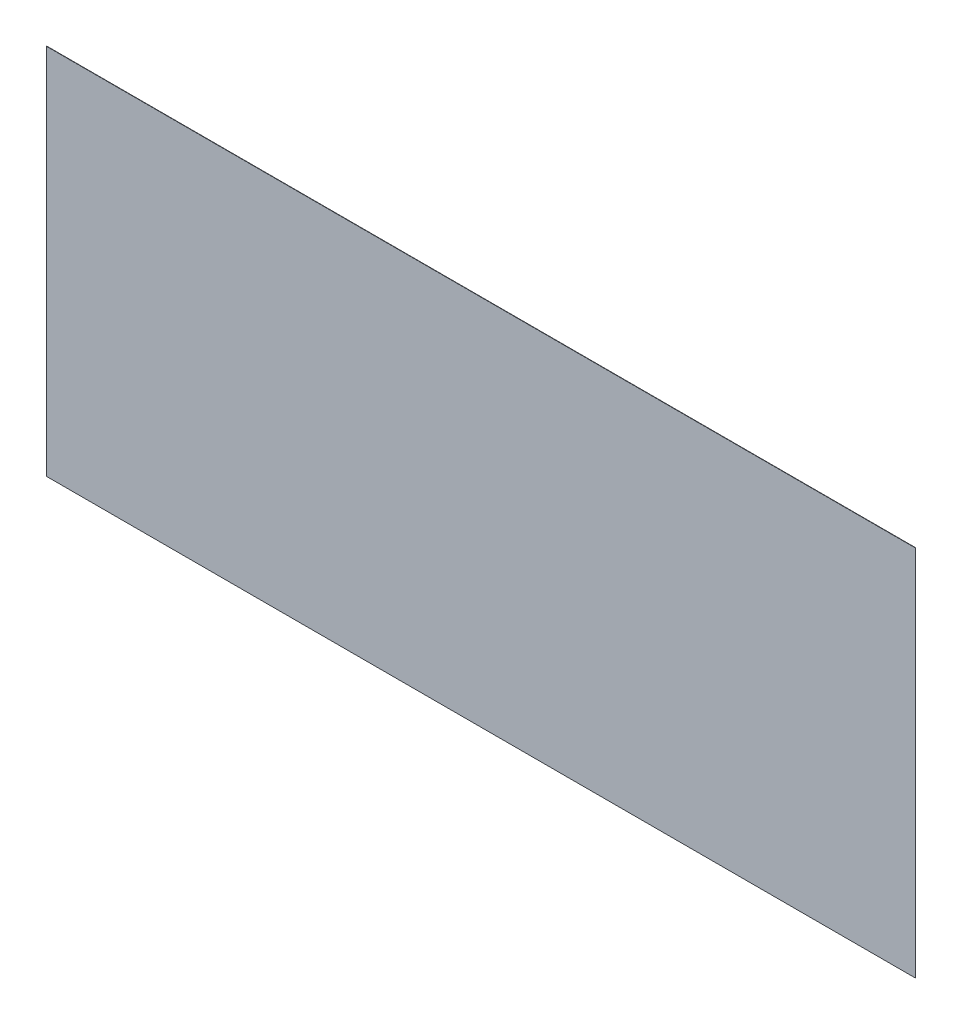
ISO-10303-21;
HEADER;
FILE_DESCRIPTION(('STEP AP214'),'2;1');
FILE_NAME('part.step','',(''),(''),'','','');
FILE_SCHEMA(('AUTOMOTIVE_DESIGN { 1 0 10303 214 1 1 1 1 }'));
ENDSEC;
DATA;
#1=APPLICATION_CONTEXT('core data for automotive mechanical design processes');
#2=APPLICATION_PROTOCOL_DEFINITION('international standard','automotive_design',2000,#1);
#3=PRODUCT_CONTEXT('',#1,'mechanical');
#4=PRODUCT('Part','Part','',(#3));
#5=PRODUCT_RELATED_PRODUCT_CATEGORY('part','',(#4));
#6=PRODUCT_DEFINITION_FORMATION('','',#4);
#7=PRODUCT_DEFINITION_CONTEXT('part definition',#1,'design');
#8=PRODUCT_DEFINITION('design','',#6,#7);
#9=PRODUCT_DEFINITION_SHAPE('','',#8);
#10=(LENGTH_UNIT() NAMED_UNIT(*) SI_UNIT(.MILLI.,.METRE.));
#11=(NAMED_UNIT(*) PLANE_ANGLE_UNIT() SI_UNIT($,.RADIAN.));
#12=(NAMED_UNIT(*) SI_UNIT($,.STERADIAN.) SOLID_ANGLE_UNIT());
#13=UNCERTAINTY_MEASURE_WITH_UNIT(LENGTH_MEASURE(1.E-05),#10,'distance_accuracy_value','');
#14=(GEOMETRIC_REPRESENTATION_CONTEXT(3) GLOBAL_UNCERTAINTY_ASSIGNED_CONTEXT((#13)) GLOBAL_UNIT_ASSIGNED_CONTEXT((#10,
#11,#12)) REPRESENTATION_CONTEXT('',''));
#15=CARTESIAN_POINT('',(0.,0.,0.));
#16=DIRECTION('',(0.,0.,1.));
#17=DIRECTION('',(1.,0.,0.));
#18=AXIS2_PLACEMENT_3D('',#15,#16,#17);
#19=CARTESIAN_POINT('',(-1050.,450.,0.9));
#20=DIRECTION('',(0.,-1.,0.));
#21=DIRECTION('',(0.,0.,-1.));
#22=AXIS2_PLACEMENT_3D('',#19,#20,#21);
#23=PLANE('',#22);
#24=DIRECTION('',(-1.,0.,0.));
#25=VECTOR('',#24,1.);
#26=CARTESIAN_POINT('',(-1050.,450.,0.));
#27=LINE('',#26,#25);
#28=CARTESIAN_POINT('',(1050.,450.,0.));
#29=VERTEX_POINT('',#28);
#30=CARTESIAN_POINT('',(-1050.,450.,0.));
#31=VERTEX_POINT('',#30);
#32=EDGE_CURVE('E182',#29,#31,#27,.T.);
#33=ORIENTED_EDGE('',*,*,#32,.T.);
#34=DIRECTION('',(0.,0.,-1.));
#35=VECTOR('',#34,1.);
#36=CARTESIAN_POINT('',(-1050.,450.,0.9));
#37=LINE('',#36,#35);
#38=CARTESIAN_POINT('',(-1050.,450.,0.9));
#39=VERTEX_POINT('',#38);
#40=EDGE_CURVE('E50',#39,#31,#37,.T.);
#41=ORIENTED_EDGE('',*,*,#40,.F.);
#42=DIRECTION('',(-1.,0.,0.));
#43=VECTOR('',#42,1.);
#44=CARTESIAN_POINT('',(-1050.,450.,0.9));
#45=LINE('',#44,#43);
#46=CARTESIAN_POINT('',(1050.,450.,0.9));
#47=VERTEX_POINT('',#46);
#48=EDGE_CURVE('E94',#47,#39,#45,.T.);
#49=ORIENTED_EDGE('',*,*,#48,.F.);
#50=DIRECTION('',(0.,0.,-1.));
#51=VECTOR('',#50,1.);
#52=CARTESIAN_POINT('',(1050.,450.,0.9));
#53=LINE('',#52,#51);
#54=EDGE_CURVE('E11',#47,#29,#53,.T.);
#55=ORIENTED_EDGE('',*,*,#54,.T.);
#56=EDGE_LOOP('',(#33,#41,#49,#55));
#57=FACE_BOUND('',#56,.T.);
#58=DIRECTION('',(-1.,0.,0.));
#59=VECTOR('',#58,1.);
#60=CARTESIAN_POINT('',(0.,450.,0.35));
#61=LINE('',#60,#59);
#62=CARTESIAN_POINT('',(1049.65,450.,0.35));
#63=VERTEX_POINT('',#62);
#64=CARTESIAN_POINT('',(-1049.65,450.,0.35));
#65=VERTEX_POINT('',#64);
#66=EDGE_CURVE('E141',#63,#65,#61,.T.);
#67=ORIENTED_EDGE('',*,*,#66,.F.);
#68=DIRECTION('',(0.,0.,-1.));
#69=VECTOR('',#68,1.);
#70=CARTESIAN_POINT('',(1049.65,450.,0.9));
#71=LINE('',#70,#69);
#72=CARTESIAN_POINT('',(1049.65,450.,0.55));
#73=VERTEX_POINT('',#72);
#74=EDGE_CURVE('E139',#73,#63,#71,.T.);
#75=ORIENTED_EDGE('',*,*,#74,.F.);
#76=DIRECTION('',(-1.,0.,0.));
#77=VECTOR('',#76,1.);
#78=CARTESIAN_POINT('',(0.,450.,0.55));
#79=LINE('',#78,#77);
#80=CARTESIAN_POINT('',(-1049.65,450.,0.55));
#81=VERTEX_POINT('',#80);
#82=EDGE_CURVE('E147',#73,#81,#79,.T.);
#83=ORIENTED_EDGE('',*,*,#82,.T.);
#84=DIRECTION('',(0.,0.,-1.));
#85=VECTOR('',#84,1.);
#86=CARTESIAN_POINT('',(-1049.65,450.,0.9));
#87=LINE('',#86,#85);
#88=EDGE_CURVE('E154',#81,#65,#87,.T.);
#89=ORIENTED_EDGE('',*,*,#88,.T.);
#90=EDGE_LOOP('',(#67,#75,#83,#89));
#91=FACE_BOUND('',#90,.T.);
#92=ADVANCED_FACE('F41',(#57,#91),#23,.F.);
#93=CARTESIAN_POINT('',(1050.,-450.,0.9));
#94=DIRECTION('',(-1.,0.,0.));
#95=DIRECTION('',(0.,0.,1.));
#96=AXIS2_PLACEMENT_3D('',#93,#94,#95);
#97=PLANE('',#96);
#98=DIRECTION('',(0.,1.,0.));
#99=VECTOR('',#98,1.);
#100=CARTESIAN_POINT('',(1050.,-450.,0.));
#101=LINE('',#100,#99);
#102=CARTESIAN_POINT('',(1050.,-450.,0.));
#103=VERTEX_POINT('',#102);
#104=EDGE_CURVE('E160',#103,#29,#101,.T.);
#105=ORIENTED_EDGE('',*,*,#104,.T.);
#106=ORIENTED_EDGE('',*,*,#54,.F.);
#107=DIRECTION('',(0.,1.,0.));
#108=VECTOR('',#107,1.);
#109=CARTESIAN_POINT('',(1050.,-450.,0.9));
#110=LINE('',#109,#108);
#111=CARTESIAN_POINT('',(1050.,-450.,0.9));
#112=VERTEX_POINT('',#111);
#113=EDGE_CURVE('E168',#112,#47,#110,.T.);
#114=ORIENTED_EDGE('',*,*,#113,.F.);
#115=DIRECTION('',(0.,0.,-1.));
#116=VECTOR('',#115,1.);
#117=CARTESIAN_POINT('',(1050.,-450.,0.9));
#118=LINE('',#117,#116);
#119=EDGE_CURVE('E178',#112,#103,#118,.T.);
#120=ORIENTED_EDGE('',*,*,#119,.T.);
#121=EDGE_LOOP('',(#105,#106,#114,#120));
#122=FACE_BOUND('',#121,.T.);
#123=ADVANCED_FACE('F43',(#122),#97,.F.);
#124=CARTESIAN_POINT('',(-1050.,-450.,0.9));
#125=DIRECTION('',(1.,0.,0.));
#126=DIRECTION('',(0.,0.,-1.));
#127=AXIS2_PLACEMENT_3D('',#124,#125,#126);
#128=PLANE('',#127);
#129=DIRECTION('',(0.,-1.,0.));
#130=VECTOR('',#129,1.);
#131=CARTESIAN_POINT('',(-1050.,-450.,0.));
#132=LINE('',#131,#130);
#133=CARTESIAN_POINT('',(-1050.,-450.,0.));
#134=VERTEX_POINT('',#133);
#135=EDGE_CURVE('E185',#31,#134,#132,.T.);
#136=ORIENTED_EDGE('',*,*,#135,.T.);
#137=DIRECTION('',(0.,0.,-1.));
#138=VECTOR('',#137,1.);
#139=CARTESIAN_POINT('',(-1050.,-450.,0.9));
#140=LINE('',#139,#138);
#141=CARTESIAN_POINT('',(-1050.,-450.,0.9));
#142=VERTEX_POINT('',#141);
#143=EDGE_CURVE('E192',#142,#134,#140,.T.);
#144=ORIENTED_EDGE('',*,*,#143,.F.);
#145=DIRECTION('',(0.,-1.,0.));
#146=VECTOR('',#145,1.);
#147=CARTESIAN_POINT('',(-1050.,-450.,0.9));
#148=LINE('',#147,#146);
#149=EDGE_CURVE('E173',#39,#142,#148,.T.);
#150=ORIENTED_EDGE('',*,*,#149,.F.);
#151=ORIENTED_EDGE('',*,*,#40,.T.);
#152=EDGE_LOOP('',(#136,#144,#150,#151));
#153=FACE_BOUND('',#152,.T.);
#154=ADVANCED_FACE('F199',(#153),#128,.F.);
#155=CARTESIAN_POINT('',(-1050.,-450.,0.9));
#156=DIRECTION('',(0.,1.,0.));
#157=DIRECTION('',(0.,0.,1.));
#158=AXIS2_PLACEMENT_3D('',#155,#156,#157);
#159=PLANE('',#158);
#160=DIRECTION('',(1.,0.,0.));
#161=VECTOR('',#160,1.);
#162=CARTESIAN_POINT('',(-1050.,-450.,0.));
#163=LINE('',#162,#161);
#164=EDGE_CURVE('E87',#134,#103,#163,.T.);
#165=ORIENTED_EDGE('',*,*,#164,.T.);
#166=ORIENTED_EDGE('',*,*,#119,.F.);
#167=DIRECTION('',(1.,0.,0.));
#168=VECTOR('',#167,1.);
#169=CARTESIAN_POINT('',(-1050.,-450.,0.9));
#170=LINE('',#169,#168);
#171=EDGE_CURVE('E66',#142,#112,#170,.T.);
#172=ORIENTED_EDGE('',*,*,#171,.F.);
#173=ORIENTED_EDGE('',*,*,#143,.T.);
#174=EDGE_LOOP('',(#165,#166,#172,#173));
#175=FACE_BOUND('',#174,.T.);
#176=ADVANCED_FACE('F207',(#175),#159,.F.);
#177=CARTESIAN_POINT('',(0.,0.,0.9));
#178=DIRECTION('',(0.,0.,-1.));
#179=DIRECTION('',(-1.,0.,0.));
#180=AXIS2_PLACEMENT_3D('',#177,#178,#179);
#181=PLANE('',#180);
#182=ORIENTED_EDGE('',*,*,#113,.T.);
#183=ORIENTED_EDGE('',*,*,#48,.T.);
#184=ORIENTED_EDGE('',*,*,#149,.T.);
#185=ORIENTED_EDGE('',*,*,#171,.T.);
#186=EDGE_LOOP('',(#182,#183,#184,#185));
#187=FACE_BOUND('',#186,.T.);
#188=ADVANCED_FACE('F209',(#187),#181,.F.);
#189=CARTESIAN_POINT('',(0.,0.,0.));
#190=DIRECTION('',(0.,0.,-1.));
#191=DIRECTION('',(-1.,0.,0.));
#192=AXIS2_PLACEMENT_3D('',#189,#190,#191);
#193=PLANE('',#192);
#194=ORIENTED_EDGE('',*,*,#104,.F.);
#195=ORIENTED_EDGE('',*,*,#164,.F.);
#196=ORIENTED_EDGE('',*,*,#135,.F.);
#197=ORIENTED_EDGE('',*,*,#32,.F.);
#198=EDGE_LOOP('',(#194,#195,#196,#197));
#199=FACE_BOUND('',#198,.T.);
#200=ADVANCED_FACE('F203',(#199),#193,.T.);
#201=CARTESIAN_POINT('',(1049.65,-450.,0.9));
#202=DIRECTION('',(-1.,0.,0.));
#203=DIRECTION('',(0.,0.,1.));
#204=AXIS2_PLACEMENT_3D('',#201,#202,#203);
#205=PLANE('',#204);
#206=DIRECTION('',(0.,1.,0.));
#207=VECTOR('',#206,1.);
#208=CARTESIAN_POINT('',(1049.65,0.,0.35));
#209=LINE('',#208,#207);
#210=CARTESIAN_POINT('',(1049.65,-449.65,0.35));
#211=VERTEX_POINT('',#210);
#212=EDGE_CURVE('E121',#211,#63,#209,.T.);
#213=ORIENTED_EDGE('',*,*,#212,.F.);
#214=DIRECTION('',(0.,0.,-1.));
#215=VECTOR('',#214,1.);
#216=CARTESIAN_POINT('',(1049.65,-449.65,0.9));
#217=LINE('',#216,#215);
#218=CARTESIAN_POINT('',(1049.65,-449.65,0.55));
#219=VERTEX_POINT('',#218);
#220=EDGE_CURVE('E130',#219,#211,#217,.T.);
#221=ORIENTED_EDGE('',*,*,#220,.F.);
#222=DIRECTION('',(0.,1.,0.));
#223=VECTOR('',#222,1.);
#224=CARTESIAN_POINT('',(1049.65,0.,0.55));
#225=LINE('',#224,#223);
#226=EDGE_CURVE('E57',#219,#73,#225,.T.);
#227=ORIENTED_EDGE('',*,*,#226,.T.);
#228=ORIENTED_EDGE('',*,*,#74,.T.);
#229=EDGE_LOOP('',(#213,#221,#227,#228));
#230=FACE_BOUND('',#229,.T.);
#231=ADVANCED_FACE('F137',(#230),#205,.T.);
#232=CARTESIAN_POINT('',(-1049.65,-450.,0.9));
#233=DIRECTION('',(1.,0.,0.));
#234=DIRECTION('',(0.,0.,-1.));
#235=AXIS2_PLACEMENT_3D('',#232,#233,#234);
#236=PLANE('',#235);
#237=DIRECTION('',(0.,-1.,0.));
#238=VECTOR('',#237,1.);
#239=CARTESIAN_POINT('',(-1049.65,0.,0.35));
#240=LINE('',#239,#238);
#241=CARTESIAN_POINT('',(-1049.65,-449.65,0.35));
#242=VERTEX_POINT('',#241);
#243=EDGE_CURVE('E124',#65,#242,#240,.T.);
#244=ORIENTED_EDGE('',*,*,#243,.F.);
#245=ORIENTED_EDGE('',*,*,#88,.F.);
#246=DIRECTION('',(0.,-1.,0.));
#247=VECTOR('',#246,1.);
#248=CARTESIAN_POINT('',(-1049.65,0.,0.55));
#249=LINE('',#248,#247);
#250=CARTESIAN_POINT('',(-1049.65,-449.65,0.55));
#251=VERTEX_POINT('',#250);
#252=EDGE_CURVE('E151',#81,#251,#249,.T.);
#253=ORIENTED_EDGE('',*,*,#252,.T.);
#254=DIRECTION('',(0.,0.,-1.));
#255=VECTOR('',#254,1.);
#256=CARTESIAN_POINT('',(-1049.65,-449.65,0.9));
#257=LINE('',#256,#255);
#258=EDGE_CURVE('E135',#251,#242,#257,.T.);
#259=ORIENTED_EDGE('',*,*,#258,.T.);
#260=EDGE_LOOP('',(#244,#245,#253,#259));
#261=FACE_BOUND('',#260,.T.);
#262=ADVANCED_FACE('F224',(#261),#236,.T.);
#263=CARTESIAN_POINT('',(-1050.,-449.65,0.9));
#264=DIRECTION('',(0.,1.,0.));
#265=DIRECTION('',(0.,0.,1.));
#266=AXIS2_PLACEMENT_3D('',#263,#264,#265);
#267=PLANE('',#266);
#268=DIRECTION('',(1.,0.,0.));
#269=VECTOR('',#268,1.);
#270=CARTESIAN_POINT('',(0.,-449.65,0.35));
#271=LINE('',#270,#269);
#272=EDGE_CURVE('E117',#242,#211,#271,.T.);
#273=ORIENTED_EDGE('',*,*,#272,.F.);
#274=ORIENTED_EDGE('',*,*,#258,.F.);
#275=DIRECTION('',(1.,0.,0.));
#276=VECTOR('',#275,1.);
#277=CARTESIAN_POINT('',(0.,-449.65,0.55));
#278=LINE('',#277,#276);
#279=EDGE_CURVE('E133',#251,#219,#278,.T.);
#280=ORIENTED_EDGE('',*,*,#279,.T.);
#281=ORIENTED_EDGE('',*,*,#220,.T.);
#282=EDGE_LOOP('',(#273,#274,#280,#281));
#283=FACE_BOUND('',#282,.T.);
#284=ADVANCED_FACE('F131',(#283),#267,.T.);
#285=CARTESIAN_POINT('',(0.,0.,0.55));
#286=DIRECTION('',(0.,0.,-1.));
#287=DIRECTION('',(-1.,0.,0.));
#288=AXIS2_PLACEMENT_3D('',#285,#286,#287);
#289=PLANE('',#288);
#290=ORIENTED_EDGE('',*,*,#226,.F.);
#291=ORIENTED_EDGE('',*,*,#279,.F.);
#292=ORIENTED_EDGE('',*,*,#252,.F.);
#293=ORIENTED_EDGE('',*,*,#82,.F.);
#294=EDGE_LOOP('',(#290,#291,#292,#293));
#295=FACE_BOUND('',#294,.T.);
#296=ADVANCED_FACE('F227',(#295),#289,.T.);
#297=CARTESIAN_POINT('',(0.,0.,0.35));
#298=DIRECTION('',(0.,0.,-1.));
#299=DIRECTION('',(-1.,0.,0.));
#300=AXIS2_PLACEMENT_3D('',#297,#298,#299);
#301=PLANE('',#300);
#302=ORIENTED_EDGE('',*,*,#212,.T.);
#303=ORIENTED_EDGE('',*,*,#66,.T.);
#304=ORIENTED_EDGE('',*,*,#243,.T.);
#305=ORIENTED_EDGE('',*,*,#272,.T.);
#306=EDGE_LOOP('',(#302,#303,#304,#305));
#307=FACE_BOUND('',#306,.T.);
#308=ADVANCED_FACE('F119',(#307),#301,.F.);
#309=CLOSED_SHELL('',(#92,#123,#154,#176,#188,#200,#231,#262,#284,#296,#308));
#310=MANIFOLD_SOLID_BREP('B2',#309);
#311=ADVANCED_BREP_SHAPE_REPRESENTATION('',(#18,#310),#14);
#312=SHAPE_DEFINITION_REPRESENTATION(#9,#311);
ENDSEC;
END-ISO-10303-21;
